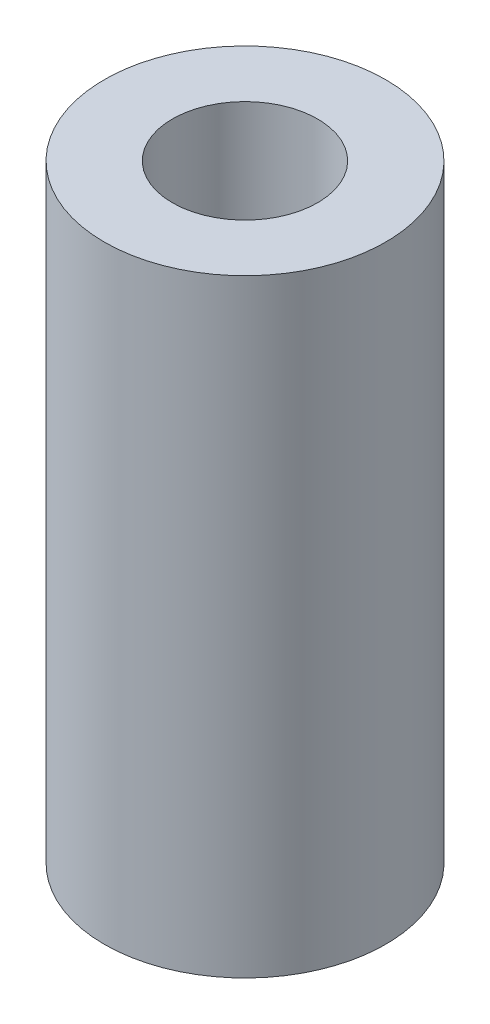
ISO-10303-21;
HEADER;
FILE_DESCRIPTION(('STEP AP214'),'2;1');
FILE_NAME('part.step','',(''),(''),'','','');
FILE_SCHEMA(('AUTOMOTIVE_DESIGN { 1 0 10303 214 1 1 1 1 }'));
ENDSEC;
DATA;
#1=APPLICATION_CONTEXT('core data for automotive mechanical design processes');
#2=APPLICATION_PROTOCOL_DEFINITION('international standard','automotive_design',2000,#1);
#3=PRODUCT_CONTEXT('',#1,'mechanical');
#4=PRODUCT('Part','Part','',(#3));
#5=PRODUCT_RELATED_PRODUCT_CATEGORY('part','',(#4));
#6=PRODUCT_DEFINITION_FORMATION('','',#4);
#7=PRODUCT_DEFINITION_CONTEXT('part definition',#1,'design');
#8=PRODUCT_DEFINITION('design','',#6,#7);
#9=PRODUCT_DEFINITION_SHAPE('','',#8);
#10=(LENGTH_UNIT() NAMED_UNIT(*) SI_UNIT(.MILLI.,.METRE.));
#11=(NAMED_UNIT(*) PLANE_ANGLE_UNIT() SI_UNIT($,.RADIAN.));
#12=(NAMED_UNIT(*) SI_UNIT($,.STERADIAN.) SOLID_ANGLE_UNIT());
#13=UNCERTAINTY_MEASURE_WITH_UNIT(LENGTH_MEASURE(1.E-05),#10,'distance_accuracy_value','');
#14=(GEOMETRIC_REPRESENTATION_CONTEXT(3) GLOBAL_UNCERTAINTY_ASSIGNED_CONTEXT((#13)) GLOBAL_UNIT_ASSIGNED_CONTEXT((#10,
#11,#12)) REPRESENTATION_CONTEXT('',''));
#15=CARTESIAN_POINT('',(0.,0.,0.));
#16=DIRECTION('',(0.,0.,1.));
#17=DIRECTION('',(1.,0.,0.));
#18=AXIS2_PLACEMENT_3D('',#15,#16,#17);
#19=CARTESIAN_POINT('',(0.,13.4,0.));
#20=DIRECTION('',(0.,1.,0.));
#21=DIRECTION('',(0.,0.,1.));
#22=AXIS2_PLACEMENT_3D('',#19,#20,#21);
#23=PLANE('',#22);
#24=CARTESIAN_POINT('',(0.,13.4,0.));
#25=DIRECTION('',(0.,1.,0.));
#26=DIRECTION('',(0.,0.,1.));
#27=AXIS2_PLACEMENT_3D('',#24,#25,#26);
#28=CIRCLE('',#27,3.1);
#29=CARTESIAN_POINT('',(0.,13.4,3.1));
#30=VERTEX_POINT('',#29);
#31=EDGE_CURVE('E10',#30,#30,#28,.T.);
#32=ORIENTED_EDGE('',*,*,#31,.T.);
#33=EDGE_LOOP('',(#32));
#34=FACE_BOUND('',#33,.T.);
#35=CARTESIAN_POINT('',(0.,13.4,0.));
#36=DIRECTION('',(0.,1.,0.));
#37=DIRECTION('',(0.,0.,1.));
#38=AXIS2_PLACEMENT_3D('',#35,#36,#37);
#39=CIRCLE('',#38,1.6);
#40=CARTESIAN_POINT('',(0.,13.4,1.6));
#41=VERTEX_POINT('',#40);
#42=EDGE_CURVE('E50',#41,#41,#39,.T.);
#43=ORIENTED_EDGE('',*,*,#42,.F.);
#44=EDGE_LOOP('',(#43));
#45=FACE_BOUND('',#44,.T.);
#46=ADVANCED_FACE('F37',(#34,#45),#23,.T.);
#47=CARTESIAN_POINT('',(0.,0.,0.));
#48=DIRECTION('',(0.,1.,0.));
#49=DIRECTION('',(0.,0.,1.));
#50=AXIS2_PLACEMENT_3D('',#47,#48,#49);
#51=PLANE('',#50);
#52=CARTESIAN_POINT('',(0.,0.,0.));
#53=DIRECTION('',(0.,1.,0.));
#54=DIRECTION('',(0.,0.,1.));
#55=AXIS2_PLACEMENT_3D('',#52,#53,#54);
#56=CIRCLE('',#55,3.1);
#57=CARTESIAN_POINT('',(0.,0.,3.1));
#58=VERTEX_POINT('',#57);
#59=EDGE_CURVE('E41',#58,#58,#56,.T.);
#60=ORIENTED_EDGE('',*,*,#59,.F.);
#61=EDGE_LOOP('',(#60));
#62=FACE_BOUND('',#61,.T.);
#63=CARTESIAN_POINT('',(0.,0.,0.));
#64=DIRECTION('',(0.,1.,0.));
#65=DIRECTION('',(0.,0.,1.));
#66=AXIS2_PLACEMENT_3D('',#63,#64,#65);
#67=CIRCLE('',#66,1.6);
#68=CARTESIAN_POINT('',(0.,0.,1.6));
#69=VERTEX_POINT('',#68);
#70=EDGE_CURVE('E52',#69,#69,#67,.T.);
#71=ORIENTED_EDGE('',*,*,#70,.T.);
#72=EDGE_LOOP('',(#71));
#73=FACE_BOUND('',#72,.T.);
#74=ADVANCED_FACE('F64',(#62,#73),#51,.F.);
#75=CARTESIAN_POINT('',(0.,13.4,0.));
#76=DIRECTION('',(0.,-1.,0.));
#77=DIRECTION('',(0.,0.,-1.));
#78=AXIS2_PLACEMENT_3D('',#75,#76,#77);
#79=CYLINDRICAL_SURFACE('',#78,3.1);
#80=ORIENTED_EDGE('',*,*,#31,.F.);
#81=EDGE_LOOP('',(#80));
#82=FACE_BOUND('',#81,.T.);
#83=ORIENTED_EDGE('',*,*,#59,.T.);
#84=EDGE_LOOP('',(#83));
#85=FACE_BOUND('',#84,.T.);
#86=ADVANCED_FACE('F39',(#82,#85),#79,.T.);
#87=CARTESIAN_POINT('',(0.,13.4,0.));
#88=DIRECTION('',(0.,-1.,0.));
#89=DIRECTION('',(0.,0.,-1.));
#90=AXIS2_PLACEMENT_3D('',#87,#88,#89);
#91=CYLINDRICAL_SURFACE('',#90,1.6);
#92=ORIENTED_EDGE('',*,*,#42,.T.);
#93=EDGE_LOOP('',(#92));
#94=FACE_BOUND('',#93,.T.);
#95=ORIENTED_EDGE('',*,*,#70,.F.);
#96=EDGE_LOOP('',(#95));
#97=FACE_BOUND('',#96,.T.);
#98=ADVANCED_FACE('F60',(#94,#97),#91,.F.);
#99=CLOSED_SHELL('',(#46,#74,#86,#98));
#100=MANIFOLD_SOLID_BREP('B2',#99);
#101=ADVANCED_BREP_SHAPE_REPRESENTATION('',(#18,#100),#14);
#102=SHAPE_DEFINITION_REPRESENTATION(#9,#101);
ENDSEC;
END-ISO-10303-21;
